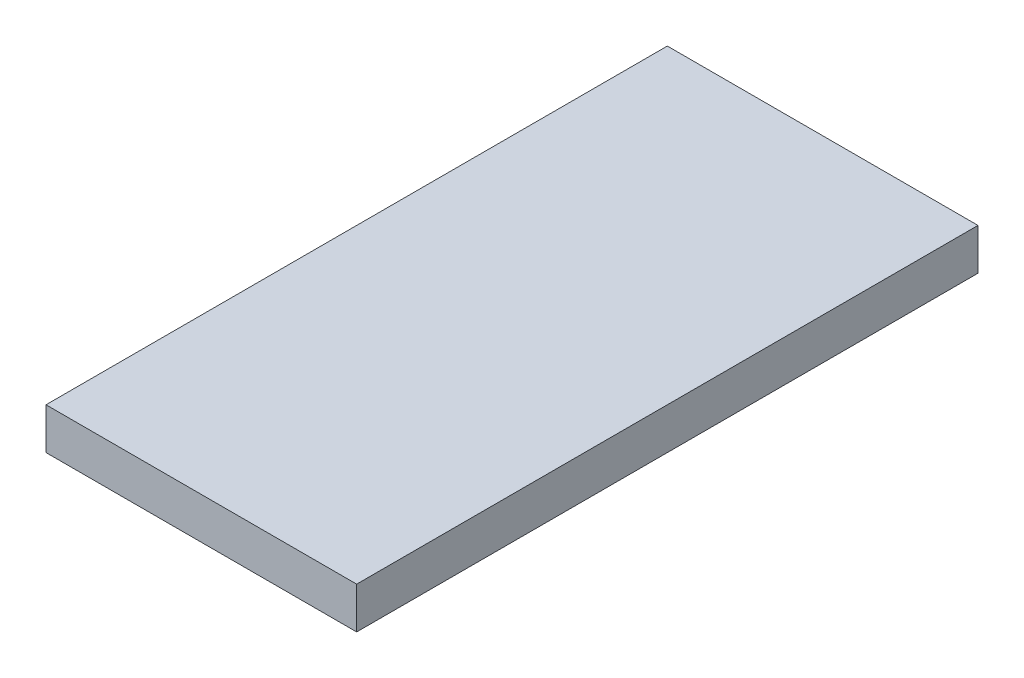
ISO-10303-21;
HEADER;
FILE_DESCRIPTION(('STEP AP214'),'2;1');
FILE_NAME('part.step','',(''),(''),'','','');
FILE_SCHEMA(('AUTOMOTIVE_DESIGN { 1 0 10303 214 1 1 1 1 }'));
ENDSEC;
DATA;
#1=APPLICATION_CONTEXT('core data for automotive mechanical design processes');
#2=APPLICATION_PROTOCOL_DEFINITION('international standard','automotive_design',2000,#1);
#3=PRODUCT_CONTEXT('',#1,'mechanical');
#4=PRODUCT('Part','Part','',(#3));
#5=PRODUCT_RELATED_PRODUCT_CATEGORY('part','',(#4));
#6=PRODUCT_DEFINITION_FORMATION('','',#4);
#7=PRODUCT_DEFINITION_CONTEXT('part definition',#1,'design');
#8=PRODUCT_DEFINITION('design','',#6,#7);
#9=PRODUCT_DEFINITION_SHAPE('','',#8);
#10=(LENGTH_UNIT() NAMED_UNIT(*) SI_UNIT(.MILLI.,.METRE.));
#11=(NAMED_UNIT(*) PLANE_ANGLE_UNIT() SI_UNIT($,.RADIAN.));
#12=(NAMED_UNIT(*) SI_UNIT($,.STERADIAN.) SOLID_ANGLE_UNIT());
#13=UNCERTAINTY_MEASURE_WITH_UNIT(LENGTH_MEASURE(1.E-05),#10,'distance_accuracy_value','');
#14=(GEOMETRIC_REPRESENTATION_CONTEXT(3) GLOBAL_UNCERTAINTY_ASSIGNED_CONTEXT((#13)) GLOBAL_UNIT_ASSIGNED_CONTEXT((#10,
#11,#12)) REPRESENTATION_CONTEXT('',''));
#15=CARTESIAN_POINT('',(0.,0.,0.));
#16=DIRECTION('',(0.,0.,1.));
#17=DIRECTION('',(1.,0.,0.));
#18=AXIS2_PLACEMENT_3D('',#15,#16,#17);
#19=CARTESIAN_POINT('',(-0.75,0.1,1.5));
#20=DIRECTION('',(1.,0.,0.));
#21=DIRECTION('',(0.,0.,-1.));
#22=AXIS2_PLACEMENT_3D('',#19,#20,#21);
#23=PLANE('',#22);
#24=DIRECTION('',(0.,0.,1.));
#25=VECTOR('',#24,1.);
#26=CARTESIAN_POINT('',(-0.75,-0.1,1.5));
#27=LINE('',#26,#25);
#28=CARTESIAN_POINT('',(-0.75,-0.1,-1.5));
#29=VERTEX_POINT('',#28);
#30=CARTESIAN_POINT('',(-0.75,-0.1,1.5));
#31=VERTEX_POINT('',#30);
#32=EDGE_CURVE('E107',#29,#31,#27,.T.);
#33=ORIENTED_EDGE('',*,*,#32,.T.);
#34=DIRECTION('',(0.,-1.,0.));
#35=VECTOR('',#34,1.);
#36=CARTESIAN_POINT('',(-0.75,0.1,1.5));
#37=LINE('',#36,#35);
#38=CARTESIAN_POINT('',(-0.75,0.1,1.5));
#39=VERTEX_POINT('',#38);
#40=EDGE_CURVE('E11',#39,#31,#37,.T.);
#41=ORIENTED_EDGE('',*,*,#40,.F.);
#42=DIRECTION('',(0.,0.,1.));
#43=VECTOR('',#42,1.);
#44=CARTESIAN_POINT('',(-0.75,0.1,1.5));
#45=LINE('',#44,#43);
#46=CARTESIAN_POINT('',(-0.75,0.1,-1.5));
#47=VERTEX_POINT('',#46);
#48=EDGE_CURVE('E91',#47,#39,#45,.T.);
#49=ORIENTED_EDGE('',*,*,#48,.F.);
#50=DIRECTION('',(0.,-1.,0.));
#51=VECTOR('',#50,1.);
#52=CARTESIAN_POINT('',(-0.75,0.1,-1.5));
#53=LINE('',#52,#51);
#54=EDGE_CURVE('E103',#47,#29,#53,.T.);
#55=ORIENTED_EDGE('',*,*,#54,.T.);
#56=EDGE_LOOP('',(#33,#41,#49,#55));
#57=FACE_BOUND('',#56,.T.);
#58=ADVANCED_FACE('F39',(#57),#23,.F.);
#59=CARTESIAN_POINT('',(0.75,0.1,1.5));
#60=DIRECTION('',(0.,0.,-1.));
#61=DIRECTION('',(-1.,0.,0.));
#62=AXIS2_PLACEMENT_3D('',#59,#60,#61);
#63=PLANE('',#62);
#64=DIRECTION('',(1.,0.,0.));
#65=VECTOR('',#64,1.);
#66=CARTESIAN_POINT('',(0.75,-0.1,1.5));
#67=LINE('',#66,#65);
#68=CARTESIAN_POINT('',(0.75,-0.1,1.5));
#69=VERTEX_POINT('',#68);
#70=EDGE_CURVE('E96',#31,#69,#67,.T.);
#71=ORIENTED_EDGE('',*,*,#70,.T.);
#72=DIRECTION('',(0.,-1.,0.));
#73=VECTOR('',#72,1.);
#74=CARTESIAN_POINT('',(0.75,0.1,1.5));
#75=LINE('',#74,#73);
#76=CARTESIAN_POINT('',(0.75,0.1,1.5));
#77=VERTEX_POINT('',#76);
#78=EDGE_CURVE('E48',#77,#69,#75,.T.);
#79=ORIENTED_EDGE('',*,*,#78,.F.);
#80=DIRECTION('',(1.,0.,0.));
#81=VECTOR('',#80,1.);
#82=CARTESIAN_POINT('',(0.75,0.1,1.5));
#83=LINE('',#82,#81);
#84=EDGE_CURVE('E86',#39,#77,#83,.T.);
#85=ORIENTED_EDGE('',*,*,#84,.F.);
#86=ORIENTED_EDGE('',*,*,#40,.T.);
#87=EDGE_LOOP('',(#71,#79,#85,#86));
#88=FACE_BOUND('',#87,.T.);
#89=ADVANCED_FACE('F95',(#88),#63,.F.);
#90=CARTESIAN_POINT('',(0.75,0.1,1.5));
#91=DIRECTION('',(-1.,0.,0.));
#92=DIRECTION('',(0.,0.,1.));
#93=AXIS2_PLACEMENT_3D('',#90,#91,#92);
#94=PLANE('',#93);
#95=DIRECTION('',(0.,0.,-1.));
#96=VECTOR('',#95,1.);
#97=CARTESIAN_POINT('',(0.75,-0.1,1.5));
#98=LINE('',#97,#96);
#99=CARTESIAN_POINT('',(0.75,-0.1,-1.5));
#100=VERTEX_POINT('',#99);
#101=EDGE_CURVE('E73',#69,#100,#98,.T.);
#102=ORIENTED_EDGE('',*,*,#101,.T.);
#103=DIRECTION('',(0.,-1.,0.));
#104=VECTOR('',#103,1.);
#105=CARTESIAN_POINT('',(0.75,0.1,-1.5));
#106=LINE('',#105,#104);
#107=CARTESIAN_POINT('',(0.75,0.1,-1.5));
#108=VERTEX_POINT('',#107);
#109=EDGE_CURVE('E98',#108,#100,#106,.T.);
#110=ORIENTED_EDGE('',*,*,#109,.F.);
#111=DIRECTION('',(0.,0.,-1.));
#112=VECTOR('',#111,1.);
#113=CARTESIAN_POINT('',(0.75,0.1,1.5));
#114=LINE('',#113,#112);
#115=EDGE_CURVE('E89',#77,#108,#114,.T.);
#116=ORIENTED_EDGE('',*,*,#115,.F.);
#117=ORIENTED_EDGE('',*,*,#78,.T.);
#118=EDGE_LOOP('',(#102,#110,#116,#117));
#119=FACE_BOUND('',#118,.T.);
#120=ADVANCED_FACE('F99',(#119),#94,.F.);
#121=CARTESIAN_POINT('',(0.75,0.1,-1.5));
#122=DIRECTION('',(0.,0.,1.));
#123=DIRECTION('',(1.,0.,0.));
#124=AXIS2_PLACEMENT_3D('',#121,#122,#123);
#125=PLANE('',#124);
#126=DIRECTION('',(-1.,0.,0.));
#127=VECTOR('',#126,1.);
#128=CARTESIAN_POINT('',(0.75,-0.1,-1.5));
#129=LINE('',#128,#127);
#130=EDGE_CURVE('E79',#100,#29,#129,.T.);
#131=ORIENTED_EDGE('',*,*,#130,.T.);
#132=ORIENTED_EDGE('',*,*,#54,.F.);
#133=DIRECTION('',(-1.,0.,0.));
#134=VECTOR('',#133,1.);
#135=CARTESIAN_POINT('',(0.75,0.1,-1.5));
#136=LINE('',#135,#134);
#137=EDGE_CURVE('E56',#108,#47,#136,.T.);
#138=ORIENTED_EDGE('',*,*,#137,.F.);
#139=ORIENTED_EDGE('',*,*,#109,.T.);
#140=EDGE_LOOP('',(#131,#132,#138,#139));
#141=FACE_BOUND('',#140,.T.);
#142=ADVANCED_FACE('F120',(#141),#125,.F.);
#143=CARTESIAN_POINT('',(0.,0.1,0.));
#144=DIRECTION('',(0.,1.,0.));
#145=DIRECTION('',(0.,0.,1.));
#146=AXIS2_PLACEMENT_3D('',#143,#144,#145);
#147=PLANE('',#146);
#148=ORIENTED_EDGE('',*,*,#48,.T.);
#149=ORIENTED_EDGE('',*,*,#84,.T.);
#150=ORIENTED_EDGE('',*,*,#115,.T.);
#151=ORIENTED_EDGE('',*,*,#137,.T.);
#152=EDGE_LOOP('',(#148,#149,#150,#151));
#153=FACE_BOUND('',#152,.T.);
#154=ADVANCED_FACE('F87',(#153),#147,.T.);
#155=CARTESIAN_POINT('',(0.,-0.1,0.));
#156=DIRECTION('',(0.,1.,0.));
#157=DIRECTION('',(0.,0.,1.));
#158=AXIS2_PLACEMENT_3D('',#155,#156,#157);
#159=PLANE('',#158);
#160=ORIENTED_EDGE('',*,*,#32,.F.);
#161=ORIENTED_EDGE('',*,*,#130,.F.);
#162=ORIENTED_EDGE('',*,*,#101,.F.);
#163=ORIENTED_EDGE('',*,*,#70,.F.);
#164=EDGE_LOOP('',(#160,#161,#162,#163));
#165=FACE_BOUND('',#164,.T.);
#166=ADVANCED_FACE('F123',(#165),#159,.F.);
#167=CLOSED_SHELL('',(#58,#89,#120,#142,#154,#166));
#168=MANIFOLD_SOLID_BREP('B2',#167);
#169=ADVANCED_BREP_SHAPE_REPRESENTATION('',(#18,#168),#14);
#170=SHAPE_DEFINITION_REPRESENTATION(#9,#169);
ENDSEC;
END-ISO-10303-21;
